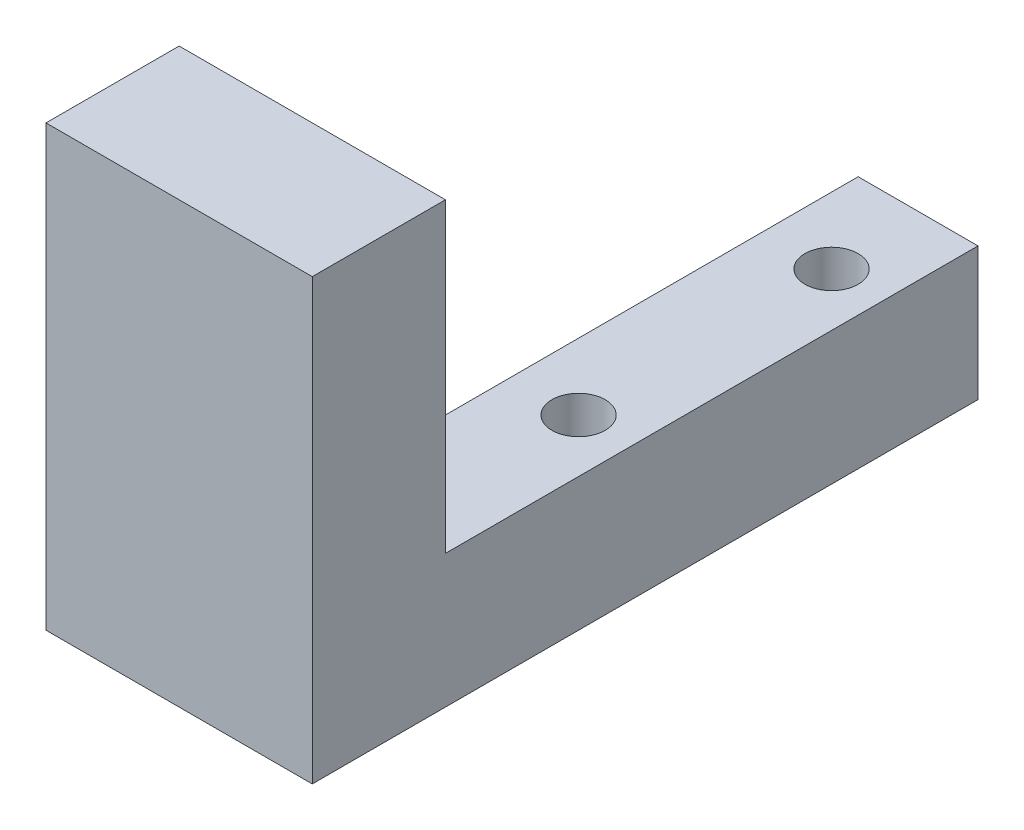
ISO-10303-21;
HEADER;
FILE_DESCRIPTION(('STEP AP214'),'2;1');
FILE_NAME('part.step','',(''),(''),'','','');
FILE_SCHEMA(('AUTOMOTIVE_DESIGN { 1 0 10303 214 1 1 1 1 }'));
ENDSEC;
DATA;
#1=APPLICATION_CONTEXT('core data for automotive mechanical design processes');
#2=APPLICATION_PROTOCOL_DEFINITION('international standard','automotive_design',2000,#1);
#3=PRODUCT_CONTEXT('',#1,'mechanical');
#4=PRODUCT('Part','Part','',(#3));
#5=PRODUCT_RELATED_PRODUCT_CATEGORY('part','',(#4));
#6=PRODUCT_DEFINITION_FORMATION('','',#4);
#7=PRODUCT_DEFINITION_CONTEXT('part definition',#1,'design');
#8=PRODUCT_DEFINITION('design','',#6,#7);
#9=PRODUCT_DEFINITION_SHAPE('','',#8);
#10=(LENGTH_UNIT() NAMED_UNIT(*) SI_UNIT(.MILLI.,.METRE.));
#11=(NAMED_UNIT(*) PLANE_ANGLE_UNIT() SI_UNIT($,.RADIAN.));
#12=(NAMED_UNIT(*) SI_UNIT($,.STERADIAN.) SOLID_ANGLE_UNIT());
#13=UNCERTAINTY_MEASURE_WITH_UNIT(LENGTH_MEASURE(1.E-05),#10,'distance_accuracy_value','');
#14=(GEOMETRIC_REPRESENTATION_CONTEXT(3) GLOBAL_UNCERTAINTY_ASSIGNED_CONTEXT((#13)) GLOBAL_UNIT_ASSIGNED_CONTEXT((#10,
#11,#12)) REPRESENTATION_CONTEXT('',''));
#15=CARTESIAN_POINT('',(0.,0.,0.));
#16=DIRECTION('',(0.,0.,1.));
#17=DIRECTION('',(1.,0.,0.));
#18=AXIS2_PLACEMENT_3D('',#15,#16,#17);
#19=CARTESIAN_POINT('',(-7.85128298838194,3.64329268292683,50.));
#20=DIRECTION('',(0.,-1.,0.));
#21=DIRECTION('',(0.,0.,-1.));
#22=AXIS2_PLACEMENT_3D('',#19,#20,#21);
#23=PLANE('',#22);
#24=CARTESIAN_POINT('',(-2.85128298838193,3.64329268292683,26.));
#25=DIRECTION('',(0.,1.,0.));
#26=DIRECTION('',(0.,0.,1.));
#27=AXIS2_PLACEMENT_3D('',#24,#25,#26);
#28=CIRCLE('',#27,2.);
#29=CARTESIAN_POINT('',(-2.85128298838193,3.64329268292683,28.));
#30=VERTEX_POINT('',#29);
#31=EDGE_CURVE('E168',#30,#30,#28,.T.);
#32=ORIENTED_EDGE('',*,*,#31,.F.);
#33=EDGE_LOOP('',(#32));
#34=FACE_BOUND('',#33,.T.);
#35=CARTESIAN_POINT('',(-2.85128298838194,3.64329268292683,7.));
#36=DIRECTION('',(0.,1.,0.));
#37=DIRECTION('',(0.,0.,1.));
#38=AXIS2_PLACEMENT_3D('',#35,#36,#37);
#39=CIRCLE('',#38,2.);
#40=CARTESIAN_POINT('',(-2.85128298838194,3.64329268292683,9.));
#41=VERTEX_POINT('',#40);
#42=EDGE_CURVE('E165',#41,#41,#39,.T.);
#43=ORIENTED_EDGE('',*,*,#42,.F.);
#44=EDGE_LOOP('',(#43));
#45=FACE_BOUND('',#44,.T.);
#46=DIRECTION('',(-1.,0.,0.));
#47=VECTOR('',#46,1.);
#48=CARTESIAN_POINT('',(-18.8512829883819,3.64329268292683,40.));
#49=LINE('',#48,#47);
#50=CARTESIAN_POINT('',(1.14871701161806,3.64329268292683,40.));
#51=VERTEX_POINT('',#50);
#52=CARTESIAN_POINT('',(-7.85128298838194,3.64329268292683,40.));
#53=VERTEX_POINT('',#52);
#54=EDGE_CURVE('E108',#51,#53,#49,.T.);
#55=ORIENTED_EDGE('',*,*,#54,.F.);
#56=DIRECTION('',(0.,0.,1.));
#57=VECTOR('',#56,1.);
#58=CARTESIAN_POINT('',(1.14871701161806,3.64329268292683,0.));
#59=LINE('',#58,#57);
#60=CARTESIAN_POINT('',(1.14871701161805,3.64329268292683,0.));
#61=VERTEX_POINT('',#60);
#62=EDGE_CURVE('E99',#61,#51,#59,.T.);
#63=ORIENTED_EDGE('',*,*,#62,.F.);
#64=DIRECTION('',(-1.,0.,0.));
#65=VECTOR('',#64,1.);
#66=CARTESIAN_POINT('',(-7.85128298838194,3.64329268292683,0.));
#67=LINE('',#66,#65);
#68=CARTESIAN_POINT('',(-7.85128298838194,3.64329268292683,0.));
#69=VERTEX_POINT('',#68);
#70=EDGE_CURVE('E60',#61,#69,#67,.T.);
#71=ORIENTED_EDGE('',*,*,#70,.T.);
#72=DIRECTION('',(0.,0.,-1.));
#73=VECTOR('',#72,1.);
#74=CARTESIAN_POINT('',(-7.85128298838194,3.64329268292683,50.));
#75=LINE('',#74,#73);
#76=EDGE_CURVE('E45',#53,#69,#75,.T.);
#77=ORIENTED_EDGE('',*,*,#76,.F.);
#78=EDGE_LOOP('',(#55,#63,#71,#77));
#79=FACE_BOUND('',#78,.T.);
#80=ADVANCED_FACE('F36',(#34,#45,#79),#23,.F.);
#81=CARTESIAN_POINT('',(-7.85128298838194,3.64329268292683,50.));
#82=DIRECTION('',(1.,0.,0.));
#83=DIRECTION('',(0.,1.,0.));
#84=AXIS2_PLACEMENT_3D('',#81,#82,#83);
#85=PLANE('',#84);
#86=DIRECTION('',(0.,-1.,0.));
#87=VECTOR('',#86,1.);
#88=CARTESIAN_POINT('',(-7.85128298838194,3.64329268292683,40.));
#89=LINE('',#88,#87);
#90=CARTESIAN_POINT('',(-7.85128298838193,-6.35670731707317,40.));
#91=VERTEX_POINT('',#90);
#92=EDGE_CURVE('E53',#53,#91,#89,.T.);
#93=ORIENTED_EDGE('',*,*,#92,.F.);
#94=ORIENTED_EDGE('',*,*,#76,.T.);
#95=DIRECTION('',(0.,-1.,0.));
#96=VECTOR('',#95,1.);
#97=CARTESIAN_POINT('',(-7.85128298838194,3.64329268292683,0.));
#98=LINE('',#97,#96);
#99=CARTESIAN_POINT('',(-7.85128298838193,-6.35670731707317,0.));
#100=VERTEX_POINT('',#99);
#101=EDGE_CURVE('E114',#69,#100,#98,.T.);
#102=ORIENTED_EDGE('',*,*,#101,.T.);
#103=DIRECTION('',(0.,0.,-1.));
#104=VECTOR('',#103,1.);
#105=CARTESIAN_POINT('',(-7.85128298838193,-6.35670731707317,50.));
#106=LINE('',#105,#104);
#107=EDGE_CURVE('E11',#91,#100,#106,.T.);
#108=ORIENTED_EDGE('',*,*,#107,.F.);
#109=EDGE_LOOP('',(#93,#94,#102,#108));
#110=FACE_BOUND('',#109,.T.);
#111=ADVANCED_FACE('F38',(#110),#85,.F.);
#112=CARTESIAN_POINT('',(-7.85128298838193,-6.35670731707317,50.));
#113=DIRECTION('',(0.,1.,0.));
#114=DIRECTION('',(0.,0.,1.));
#115=AXIS2_PLACEMENT_3D('',#112,#113,#114);
#116=PLANE('',#115);
#117=CARTESIAN_POINT('',(-2.85128298838193,-6.35670731707317,26.));
#118=DIRECTION('',(0.,1.,0.));
#119=DIRECTION('',(0.,0.,1.));
#120=AXIS2_PLACEMENT_3D('',#117,#118,#119);
#121=CIRCLE('',#120,2.);
#122=CARTESIAN_POINT('',(-2.85128298838193,-6.35670731707317,28.));
#123=VERTEX_POINT('',#122);
#124=EDGE_CURVE('E40',#123,#123,#121,.T.);
#125=ORIENTED_EDGE('',*,*,#124,.T.);
#126=EDGE_LOOP('',(#125));
#127=FACE_BOUND('',#126,.T.);
#128=CARTESIAN_POINT('',(-2.85128298838194,-6.35670731707317,7.));
#129=DIRECTION('',(0.,1.,0.));
#130=DIRECTION('',(0.,0.,1.));
#131=AXIS2_PLACEMENT_3D('',#128,#129,#130);
#132=CIRCLE('',#131,2.);
#133=CARTESIAN_POINT('',(-2.85128298838194,-6.35670731707317,9.));
#134=VERTEX_POINT('',#133);
#135=EDGE_CURVE('E152',#134,#134,#132,.T.);
#136=ORIENTED_EDGE('',*,*,#135,.T.);
#137=EDGE_LOOP('',(#136));
#138=FACE_BOUND('',#137,.T.);
#139=DIRECTION('',(1.,0.,0.));
#140=VECTOR('',#139,1.);
#141=CARTESIAN_POINT('',(-7.85128298838193,-6.35670731707317,0.));
#142=LINE('',#141,#140);
#143=CARTESIAN_POINT('',(1.14871701161806,-6.35670731707318,0.));
#144=VERTEX_POINT('',#143);
#145=EDGE_CURVE('E116',#100,#144,#142,.T.);
#146=ORIENTED_EDGE('',*,*,#145,.T.);
#147=DIRECTION('',(0.,0.,-1.));
#148=VECTOR('',#147,1.);
#149=CARTESIAN_POINT('',(1.14871701161806,-6.35670731707317,50.));
#150=LINE('',#149,#148);
#151=CARTESIAN_POINT('',(1.14871701161806,-6.35670731707318,50.));
#152=VERTEX_POINT('',#151);
#153=EDGE_CURVE('E102',#152,#144,#150,.T.);
#154=ORIENTED_EDGE('',*,*,#153,.F.);
#155=DIRECTION('',(1.,0.,0.));
#156=VECTOR('',#155,1.);
#157=CARTESIAN_POINT('',(-7.85128298838193,-6.35670731707317,50.));
#158=LINE('',#157,#156);
#159=CARTESIAN_POINT('',(-18.8512829883819,-6.35670731707317,50.));
#160=VERTEX_POINT('',#159);
#161=EDGE_CURVE('E115',#160,#152,#158,.T.);
#162=ORIENTED_EDGE('',*,*,#161,.F.);
#163=DIRECTION('',(0.,0.,1.));
#164=VECTOR('',#163,1.);
#165=CARTESIAN_POINT('',(-18.8512829883819,-6.35670731707317,50.));
#166=LINE('',#165,#164);
#167=CARTESIAN_POINT('',(-18.8512829883819,-6.35670731707317,40.));
#168=VERTEX_POINT('',#167);
#169=EDGE_CURVE('E136',#168,#160,#166,.T.);
#170=ORIENTED_EDGE('',*,*,#169,.F.);
#171=DIRECTION('',(1.,0.,0.));
#172=VECTOR('',#171,1.);
#173=CARTESIAN_POINT('',(-18.8512829883819,-6.35670731707317,40.));
#174=LINE('',#173,#172);
#175=EDGE_CURVE('E132',#168,#91,#174,.T.);
#176=ORIENTED_EDGE('',*,*,#175,.T.);
#177=ORIENTED_EDGE('',*,*,#107,.T.);
#178=EDGE_LOOP('',(#146,#154,#162,#170,#176,#177));
#179=FACE_BOUND('',#178,.T.);
#180=ADVANCED_FACE('F176',(#127,#138,#179),#116,.F.);
#181=CARTESIAN_POINT('',(0.,0.,50.));
#182=DIRECTION('',(0.,0.,1.));
#183=DIRECTION('',(1.,0.,0.));
#184=AXIS2_PLACEMENT_3D('',#181,#182,#183);
#185=PLANE('',#184);
#186=ORIENTED_EDGE('',*,*,#161,.T.);
#187=DIRECTION('',(0.,-1.,0.));
#188=VECTOR('',#187,1.);
#189=CARTESIAN_POINT('',(1.14871701161806,26.6432926829268,50.));
#190=LINE('',#189,#188);
#191=CARTESIAN_POINT('',(1.14871701161806,26.6432926829268,50.));
#192=VERTEX_POINT('',#191);
#193=EDGE_CURVE('E131',#192,#152,#190,.T.);
#194=ORIENTED_EDGE('',*,*,#193,.F.);
#195=DIRECTION('',(1.,0.,0.));
#196=VECTOR('',#195,1.);
#197=CARTESIAN_POINT('',(-18.8512829883819,26.6432926829268,50.));
#198=LINE('',#197,#196);
#199=CARTESIAN_POINT('',(-18.8512829883819,26.6432926829268,50.));
#200=VERTEX_POINT('',#199);
#201=EDGE_CURVE('E161',#200,#192,#198,.T.);
#202=ORIENTED_EDGE('',*,*,#201,.F.);
#203=DIRECTION('',(0.,1.,0.));
#204=VECTOR('',#203,1.);
#205=CARTESIAN_POINT('',(-18.8512829883819,3.64329268292683,50.));
#206=LINE('',#205,#204);
#207=EDGE_CURVE('E130',#160,#200,#206,.T.);
#208=ORIENTED_EDGE('',*,*,#207,.F.);
#209=EDGE_LOOP('',(#186,#194,#202,#208));
#210=FACE_BOUND('',#209,.T.);
#211=ADVANCED_FACE('F200',(#210),#185,.T.);
#212=CARTESIAN_POINT('',(0.,0.,0.));
#213=DIRECTION('',(0.,0.,1.));
#214=DIRECTION('',(1.,0.,0.));
#215=AXIS2_PLACEMENT_3D('',#212,#213,#214);
#216=PLANE('',#215);
#217=ORIENTED_EDGE('',*,*,#70,.F.);
#218=DIRECTION('',(0.,1.,0.));
#219=VECTOR('',#218,1.);
#220=CARTESIAN_POINT('',(1.14871701161806,-6.35670731707318,0.));
#221=LINE('',#220,#219);
#222=EDGE_CURVE('E96',#144,#61,#221,.T.);
#223=ORIENTED_EDGE('',*,*,#222,.F.);
#224=ORIENTED_EDGE('',*,*,#145,.F.);
#225=ORIENTED_EDGE('',*,*,#101,.F.);
#226=EDGE_LOOP('',(#217,#223,#224,#225));
#227=FACE_BOUND('',#226,.T.);
#228=ADVANCED_FACE('F112',(#227),#216,.F.);
#229=CARTESIAN_POINT('',(-18.8512829883819,3.64329268292682,40.));
#230=DIRECTION('',(0.,0.,1.));
#231=DIRECTION('',(1.,0.,0.));
#232=AXIS2_PLACEMENT_3D('',#229,#230,#231);
#233=PLANE('',#232);
#234=ORIENTED_EDGE('',*,*,#92,.T.);
#235=ORIENTED_EDGE('',*,*,#175,.F.);
#236=DIRECTION('',(0.,-1.,0.));
#237=VECTOR('',#236,1.);
#238=CARTESIAN_POINT('',(-18.8512829883819,3.64329268292682,40.));
#239=LINE('',#238,#237);
#240=CARTESIAN_POINT('',(-18.8512829883819,26.6432926829268,40.));
#241=VERTEX_POINT('',#240);
#242=EDGE_CURVE('E143',#241,#168,#239,.T.);
#243=ORIENTED_EDGE('',*,*,#242,.F.);
#244=DIRECTION('',(-1.,0.,0.));
#245=VECTOR('',#244,1.);
#246=CARTESIAN_POINT('',(-18.8512829883819,26.6432926829268,40.));
#247=LINE('',#246,#245);
#248=CARTESIAN_POINT('',(1.14871701161806,26.6432926829268,40.));
#249=VERTEX_POINT('',#248);
#250=EDGE_CURVE('E156',#249,#241,#247,.T.);
#251=ORIENTED_EDGE('',*,*,#250,.F.);
#252=DIRECTION('',(0.,-1.,0.));
#253=VECTOR('',#252,1.);
#254=CARTESIAN_POINT('',(1.14871701161806,26.6432926829268,40.));
#255=LINE('',#254,#253);
#256=EDGE_CURVE('E153',#249,#51,#255,.T.);
#257=ORIENTED_EDGE('',*,*,#256,.T.);
#258=ORIENTED_EDGE('',*,*,#54,.T.);
#259=EDGE_LOOP('',(#234,#235,#243,#251,#257,#258));
#260=FACE_BOUND('',#259,.T.);
#261=ADVANCED_FACE('F208',(#260),#233,.F.);
#262=CARTESIAN_POINT('',(-18.8512829883819,0.,0.));
#263=DIRECTION('',(1.,0.,0.));
#264=DIRECTION('',(0.,1.,0.));
#265=AXIS2_PLACEMENT_3D('',#262,#263,#264);
#266=PLANE('',#265);
#267=ORIENTED_EDGE('',*,*,#207,.T.);
#268=DIRECTION('',(0.,0.,1.));
#269=VECTOR('',#268,1.);
#270=CARTESIAN_POINT('',(-18.8512829883819,26.6432926829268,50.));
#271=LINE('',#270,#269);
#272=EDGE_CURVE('E151',#241,#200,#271,.T.);
#273=ORIENTED_EDGE('',*,*,#272,.F.);
#274=ORIENTED_EDGE('',*,*,#242,.T.);
#275=ORIENTED_EDGE('',*,*,#169,.T.);
#276=EDGE_LOOP('',(#267,#273,#274,#275));
#277=FACE_BOUND('',#276,.T.);
#278=ADVANCED_FACE('F212',(#277),#266,.F.);
#279=CARTESIAN_POINT('',(1.14871701161806,26.6432926829268,50.));
#280=DIRECTION('',(-1.,0.,0.));
#281=DIRECTION('',(0.,0.,1.));
#282=AXIS2_PLACEMENT_3D('',#279,#280,#281);
#283=PLANE('',#282);
#284=ORIENTED_EDGE('',*,*,#193,.T.);
#285=ORIENTED_EDGE('',*,*,#153,.T.);
#286=ORIENTED_EDGE('',*,*,#222,.T.);
#287=ORIENTED_EDGE('',*,*,#62,.T.);
#288=ORIENTED_EDGE('',*,*,#256,.F.);
#289=DIRECTION('',(0.,0.,-1.));
#290=VECTOR('',#289,1.);
#291=CARTESIAN_POINT('',(1.14871701161806,26.6432926829268,50.));
#292=LINE('',#291,#290);
#293=EDGE_CURVE('E159',#192,#249,#292,.T.);
#294=ORIENTED_EDGE('',*,*,#293,.F.);
#295=EDGE_LOOP('',(#284,#285,#286,#287,#288,#294));
#296=FACE_BOUND('',#295,.T.);
#297=ADVANCED_FACE('F97',(#296),#283,.F.);
#298=CARTESIAN_POINT('',(0.,26.6432926829268,0.));
#299=DIRECTION('',(0.,-1.,0.));
#300=DIRECTION('',(0.,0.,-1.));
#301=AXIS2_PLACEMENT_3D('',#298,#299,#300);
#302=PLANE('',#301);
#303=ORIENTED_EDGE('',*,*,#272,.T.);
#304=ORIENTED_EDGE('',*,*,#201,.T.);
#305=ORIENTED_EDGE('',*,*,#293,.T.);
#306=ORIENTED_EDGE('',*,*,#250,.T.);
#307=EDGE_LOOP('',(#303,#304,#305,#306));
#308=FACE_BOUND('',#307,.T.);
#309=ADVANCED_FACE('F187',(#308),#302,.F.);
#310=CARTESIAN_POINT('',(-2.85128298838194,-19.3567073170732,7.));
#311=DIRECTION('',(0.,1.,0.));
#312=DIRECTION('',(0.,0.,1.));
#313=AXIS2_PLACEMENT_3D('',#310,#311,#312);
#314=CYLINDRICAL_SURFACE('',#313,2.);
#315=ORIENTED_EDGE('',*,*,#42,.T.);
#316=EDGE_LOOP('',(#315));
#317=FACE_BOUND('',#316,.T.);
#318=ORIENTED_EDGE('',*,*,#135,.F.);
#319=EDGE_LOOP('',(#318));
#320=FACE_BOUND('',#319,.T.);
#321=ADVANCED_FACE('F181',(#317,#320),#314,.F.);
#322=CARTESIAN_POINT('',(-2.85128298838193,-19.3567073170732,26.));
#323=DIRECTION('',(0.,1.,0.));
#324=DIRECTION('',(0.,0.,1.));
#325=AXIS2_PLACEMENT_3D('',#322,#323,#324);
#326=CYLINDRICAL_SURFACE('',#325,2.);
#327=ORIENTED_EDGE('',*,*,#31,.T.);
#328=EDGE_LOOP('',(#327));
#329=FACE_BOUND('',#328,.T.);
#330=ORIENTED_EDGE('',*,*,#124,.F.);
#331=EDGE_LOOP('',(#330));
#332=FACE_BOUND('',#331,.T.);
#333=ADVANCED_FACE('F179',(#329,#332),#326,.F.);
#334=CLOSED_SHELL('',(#80,#111,#180,#211,#228,#261,#278,#297,#309,#321,#333));
#335=MANIFOLD_SOLID_BREP('B2',#334);
#336=ADVANCED_BREP_SHAPE_REPRESENTATION('',(#18,#335),#14);
#337=SHAPE_DEFINITION_REPRESENTATION(#9,#336);
ENDSEC;
END-ISO-10303-21;
